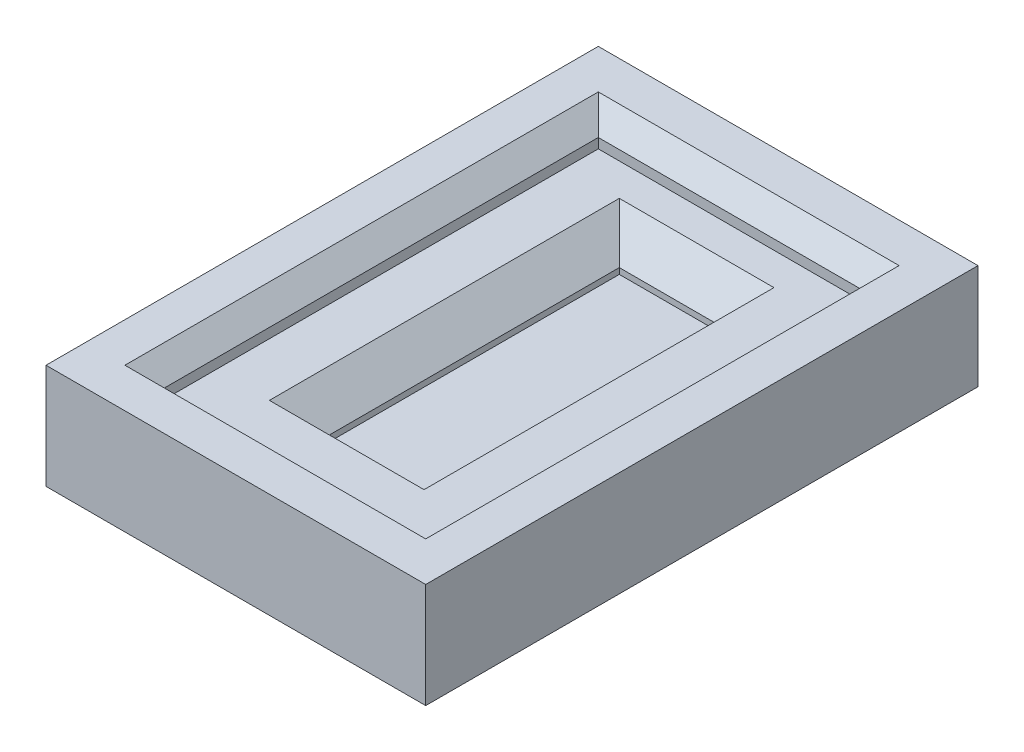
ISO-10303-21;
HEADER;
FILE_DESCRIPTION(('STEP AP214'),'2;1');
FILE_NAME('part.step','',(''),(''),'','','');
FILE_SCHEMA(('AUTOMOTIVE_DESIGN { 1 0 10303 214 1 1 1 1 }'));
ENDSEC;
DATA;
#1=APPLICATION_CONTEXT('core data for automotive mechanical design processes');
#2=APPLICATION_PROTOCOL_DEFINITION('international standard','automotive_design',2000,#1);
#3=PRODUCT_CONTEXT('',#1,'mechanical');
#4=PRODUCT('Part','Part','',(#3));
#5=PRODUCT_RELATED_PRODUCT_CATEGORY('part','',(#4));
#6=PRODUCT_DEFINITION_FORMATION('','',#4);
#7=PRODUCT_DEFINITION_CONTEXT('part definition',#1,'design');
#8=PRODUCT_DEFINITION('design','',#6,#7);
#9=PRODUCT_DEFINITION_SHAPE('','',#8);
#10=(LENGTH_UNIT() NAMED_UNIT(*) SI_UNIT(.MILLI.,.METRE.));
#11=(NAMED_UNIT(*) PLANE_ANGLE_UNIT() SI_UNIT($,.RADIAN.));
#12=(NAMED_UNIT(*) SI_UNIT($,.STERADIAN.) SOLID_ANGLE_UNIT());
#13=UNCERTAINTY_MEASURE_WITH_UNIT(LENGTH_MEASURE(1.E-05),#10,'distance_accuracy_value','');
#14=(GEOMETRIC_REPRESENTATION_CONTEXT(3) GLOBAL_UNCERTAINTY_ASSIGNED_CONTEXT((#13)) GLOBAL_UNIT_ASSIGNED_CONTEXT((#10,
#11,#12)) REPRESENTATION_CONTEXT('',''));
#15=CARTESIAN_POINT('',(0.,0.,0.));
#16=DIRECTION('',(0.,0.,1.));
#17=DIRECTION('',(1.,0.,0.));
#18=AXIS2_PLACEMENT_3D('',#15,#16,#17);
#19=CARTESIAN_POINT('',(-1199.99999999999,-1660.,18485.8011696608));
#20=DIRECTION('',(-1.,0.,0.));
#21=DIRECTION('',(0.,0.,1.));
#22=AXIS2_PLACEMENT_3D('',#19,#20,#21);
#23=PLANE('',#22);
#24=DIRECTION('',(0.,0.,-1.));
#25=VECTOR('',#24,1.);
#26=CARTESIAN_POINT('',(-1199.99999999999,-1660.,18485.8011696608));
#27=LINE('',#26,#25);
#28=CARTESIAN_POINT('',(-1199.99999999999,-1660.,3430.));
#29=VERTEX_POINT('',#28);
#30=CARTESIAN_POINT('',(-1199.99999999999,-1660.,-3920.00000000002));
#31=VERTEX_POINT('',#30);
#32=EDGE_CURVE('E205',#29,#31,#27,.T.);
#33=ORIENTED_EDGE('',*,*,#32,.T.);
#34=DIRECTION('',(0.,1.,0.));
#35=VECTOR('',#34,1.);
#36=CARTESIAN_POINT('',(-1199.99999999999,-1660.,-3920.00000000002));
#37=LINE('',#36,#35);
#38=CARTESIAN_POINT('',(-1199.99999999999,-1510.,-3920.00000000002));
#39=VERTEX_POINT('',#38);
#40=EDGE_CURVE('E54',#31,#39,#37,.T.);
#41=ORIENTED_EDGE('',*,*,#40,.T.);
#42=DIRECTION('',(0.,0.,-1.));
#43=VECTOR('',#42,1.);
#44=CARTESIAN_POINT('',(-1199.99999999999,-1510.,18485.8011696608));
#45=LINE('',#44,#43);
#46=CARTESIAN_POINT('',(-1199.99999999999,-1510.,3430.));
#47=VERTEX_POINT('',#46);
#48=EDGE_CURVE('E208',#47,#39,#45,.T.);
#49=ORIENTED_EDGE('',*,*,#48,.F.);
#50=DIRECTION('',(0.,-1.,0.));
#51=VECTOR('',#50,1.);
#52=CARTESIAN_POINT('',(-1199.99999999999,-1660.,3430.));
#53=LINE('',#52,#51);
#54=EDGE_CURVE('E270',#47,#29,#53,.T.);
#55=ORIENTED_EDGE('',*,*,#54,.T.);
#56=EDGE_LOOP('',(#33,#41,#49,#55));
#57=FACE_BOUND('',#56,.T.);
#58=ADVANCED_FACE('F38',(#57),#23,.F.);
#59=CARTESIAN_POINT('',(-1959.99999999999,-750.,18485.8011696608));
#60=DIRECTION('',(-0.707106781186549,-0.707106781186546,0.));
#61=DIRECTION('',(0.707106781186546,-0.707106781186549,0.));
#62=AXIS2_PLACEMENT_3D('',#59,#60,#61);
#63=PLANE('',#62);
#64=DIRECTION('',(0.,0.,-1.));
#65=VECTOR('',#64,1.);
#66=CARTESIAN_POINT('',(-1959.99999999999,-750.,18485.8011696608));
#67=LINE('',#66,#65);
#68=CARTESIAN_POINT('',(-1959.99999999999,-750.,4190.));
#69=VERTEX_POINT('',#68);
#70=CARTESIAN_POINT('',(-1959.99999999999,-750.,-4680.00000000002));
#71=VERTEX_POINT('',#70);
#72=EDGE_CURVE('E328',#69,#71,#67,.T.);
#73=ORIENTED_EDGE('',*,*,#72,.F.);
#74=DIRECTION('',(0.577350269189625,-0.577350269189627,-0.577350269189625));
#75=VECTOR('',#74,1.);
#76=CARTESIAN_POINT('',(-6725.26705655359,4015.26705655362,8955.2670565536));
#77=LINE('',#76,#75);
#78=EDGE_CURVE('E245',#69,#47,#77,.T.);
#79=ORIENTED_EDGE('',*,*,#78,.T.);
#80=ORIENTED_EDGE('',*,*,#48,.T.);
#81=DIRECTION('',(-0.577350269189623,0.577350269189626,-0.577350269189628));
#82=VECTOR('',#81,1.);
#83=CARTESIAN_POINT('',(5761.9337232203,-8471.93372322032,3041.93372322033));
#84=LINE('',#83,#82);
#85=EDGE_CURVE('E61',#39,#71,#84,.T.);
#86=ORIENTED_EDGE('',*,*,#85,.T.);
#87=EDGE_LOOP('',(#73,#79,#80,#86));
#88=FACE_BOUND('',#87,.T.);
#89=ADVANCED_FACE('F378',(#88),#63,.F.);
#90=CARTESIAN_POINT('',(-3312.49999999999,-750.,18485.8011696608));
#91=DIRECTION('',(0.,-1.,0.));
#92=DIRECTION('',(0.,0.,-1.));
#93=AXIS2_PLACEMENT_3D('',#90,#91,#92);
#94=PLANE('',#93);
#95=DIRECTION('',(-1.,0.,0.));
#96=VECTOR('',#95,1.);
#97=CARTESIAN_POINT('',(19062.9596417098,-750.,4190.));
#98=LINE('',#97,#96);
#99=CARTESIAN_POINT('',(1959.99999999997,-750.,4190.));
#100=VERTEX_POINT('',#99);
#101=EDGE_CURVE('E399',#100,#69,#98,.T.);
#102=ORIENTED_EDGE('',*,*,#101,.T.);
#103=ORIENTED_EDGE('',*,*,#72,.T.);
#104=DIRECTION('',(-1.,0.,0.));
#105=VECTOR('',#104,1.);
#106=CARTESIAN_POINT('',(19062.9596417098,-750.,-4680.00000000002));
#107=LINE('',#106,#105);
#108=CARTESIAN_POINT('',(1959.99999999997,-750.000000000001,-4680.00000000003));
#109=VERTEX_POINT('',#108);
#110=EDGE_CURVE('E256',#109,#71,#107,.T.);
#111=ORIENTED_EDGE('',*,*,#110,.F.);
#112=DIRECTION('',(0.,0.,-1.));
#113=VECTOR('',#112,1.);
#114=CARTESIAN_POINT('',(1959.99999999997,-750.,18485.8011696608));
#115=LINE('',#114,#113);
#116=EDGE_CURVE('E193',#100,#109,#115,.T.);
#117=ORIENTED_EDGE('',*,*,#116,.F.);
#118=EDGE_LOOP('',(#102,#103,#111,#117));
#119=FACE_BOUND('',#118,.T.);
#120=DIRECTION('',(-1.,0.,0.));
#121=VECTOR('',#120,1.);
#122=CARTESIAN_POINT('',(19062.9596417098,-749.999999999999,-5500.));
#123=LINE('',#122,#121);
#124=CARTESIAN_POINT('',(3312.49999999999,-750.,-5500.));
#125=VERTEX_POINT('',#124);
#126=CARTESIAN_POINT('',(-3312.49999999999,-750.,-5500.));
#127=VERTEX_POINT('',#126);
#128=EDGE_CURVE('E242',#125,#127,#123,.T.);
#129=ORIENTED_EDGE('',*,*,#128,.T.);
#130=DIRECTION('',(0.,0.,-1.));
#131=VECTOR('',#130,1.);
#132=CARTESIAN_POINT('',(-3312.49999999999,-750.,18485.8011696608));
#133=LINE('',#132,#131);
#134=CARTESIAN_POINT('',(-3312.49999999999,-749.999999999999,5500.));
#135=VERTEX_POINT('',#134);
#136=EDGE_CURVE('E331',#135,#127,#133,.T.);
#137=ORIENTED_EDGE('',*,*,#136,.F.);
#138=DIRECTION('',(-1.,0.,0.));
#139=VECTOR('',#138,1.);
#140=CARTESIAN_POINT('',(19062.9596417098,-749.999999999999,5500.));
#141=LINE('',#140,#139);
#142=CARTESIAN_POINT('',(3312.49999999999,-749.999999999999,5500.));
#143=VERTEX_POINT('',#142);
#144=EDGE_CURVE('E396',#143,#135,#141,.T.);
#145=ORIENTED_EDGE('',*,*,#144,.F.);
#146=DIRECTION('',(0.,0.,-1.));
#147=VECTOR('',#146,1.);
#148=CARTESIAN_POINT('',(3312.49999999999,-750.,18485.8011696608));
#149=LINE('',#148,#147);
#150=EDGE_CURVE('E185',#143,#125,#149,.T.);
#151=ORIENTED_EDGE('',*,*,#150,.T.);
#152=EDGE_LOOP('',(#129,#137,#145,#151));
#153=FACE_BOUND('',#152,.T.);
#154=ADVANCED_FACE('F382',(#119,#153),#94,.F.);
#155=CARTESIAN_POINT('',(-3312.49999999999,-500.,18485.8011696608));
#156=DIRECTION('',(-1.,0.,0.));
#157=DIRECTION('',(0.,0.,1.));
#158=AXIS2_PLACEMENT_3D('',#155,#156,#157);
#159=PLANE('',#158);
#160=DIRECTION('',(0.,0.,-1.));
#161=VECTOR('',#160,1.);
#162=CARTESIAN_POINT('',(-3312.49999999999,-500.,18485.8011696608));
#163=LINE('',#162,#161);
#164=CARTESIAN_POINT('',(-3312.49999999999,-499.999999999998,5500.));
#165=VERTEX_POINT('',#164);
#166=CARTESIAN_POINT('',(-3312.49999999999,-500.,-5499.99999999999));
#167=VERTEX_POINT('',#166);
#168=EDGE_CURVE('E335',#165,#167,#163,.T.);
#169=ORIENTED_EDGE('',*,*,#168,.F.);
#170=DIRECTION('',(0.,-1.,0.));
#171=VECTOR('',#170,1.);
#172=CARTESIAN_POINT('',(-3312.49999999999,-500.,5500.));
#173=LINE('',#172,#171);
#174=EDGE_CURVE('E289',#165,#135,#173,.T.);
#175=ORIENTED_EDGE('',*,*,#174,.T.);
#176=ORIENTED_EDGE('',*,*,#136,.T.);
#177=DIRECTION('',(0.,1.,0.));
#178=VECTOR('',#177,1.);
#179=CARTESIAN_POINT('',(-3312.49999999999,-500.,-5500.));
#180=LINE('',#179,#178);
#181=EDGE_CURVE('E244',#127,#167,#180,.T.);
#182=ORIENTED_EDGE('',*,*,#181,.T.);
#183=EDGE_LOOP('',(#169,#175,#176,#182));
#184=FACE_BOUND('',#183,.T.);
#185=ADVANCED_FACE('F374',(#184),#159,.F.);
#186=CARTESIAN_POINT('',(-3812.49999999999,0.,18485.8011696608));
#187=DIRECTION('',(-0.707106781186549,-0.707106781186546,0.));
#188=DIRECTION('',(0.707106781186546,-0.707106781186549,0.));
#189=AXIS2_PLACEMENT_3D('',#186,#187,#188);
#190=PLANE('',#189);
#191=DIRECTION('',(0.,0.,-1.));
#192=VECTOR('',#191,1.);
#193=CARTESIAN_POINT('',(-3812.49999999999,0.,18485.8011696608));
#194=LINE('',#193,#192);
#195=CARTESIAN_POINT('',(-3812.49999999999,1.33226762955019E-12,5999.99999999999));
#196=VERTEX_POINT('',#195);
#197=CARTESIAN_POINT('',(-3812.49999999999,0.,-6000.));
#198=VERTEX_POINT('',#197);
#199=EDGE_CURVE('E339',#196,#198,#194,.T.);
#200=ORIENTED_EDGE('',*,*,#199,.F.);
#201=DIRECTION('',(0.577350269189624,-0.577350269189627,-0.577350269189626));
#202=VECTOR('',#201,1.);
#203=CARTESIAN_POINT('',(-7974.43372322026,4161.93372322029,10161.9337232203));
#204=LINE('',#203,#202);
#205=EDGE_CURVE('E159',#196,#165,#204,.T.);
#206=ORIENTED_EDGE('',*,*,#205,.T.);
#207=ORIENTED_EDGE('',*,*,#168,.T.);
#208=DIRECTION('',(-0.577350269189623,0.577350269189626,-0.577350269189628));
#209=VECTOR('',#208,1.);
#210=CARTESIAN_POINT('',(4349.43372322028,-8161.93372322032,2161.93372322034));
#211=LINE('',#210,#209);
#212=EDGE_CURVE('E249',#167,#198,#211,.T.);
#213=ORIENTED_EDGE('',*,*,#212,.T.);
#214=EDGE_LOOP('',(#200,#206,#207,#213));
#215=FACE_BOUND('',#214,.T.);
#216=ADVANCED_FACE('F367',(#215),#190,.F.);
#217=CARTESIAN_POINT('',(-4812.49999999999,0.,18485.8011696608));
#218=DIRECTION('',(0.,-1.,0.));
#219=DIRECTION('',(0.,0.,-1.));
#220=AXIS2_PLACEMENT_3D('',#217,#218,#219);
#221=PLANE('',#220);
#222=DIRECTION('',(-1.,0.,0.));
#223=VECTOR('',#222,1.);
#224=CARTESIAN_POINT('',(19062.9596417098,1.33226762955019E-12,5999.99999999999));
#225=LINE('',#224,#223);
#226=CARTESIAN_POINT('',(3812.49999999999,1.33226762955019E-12,5999.99999999999));
#227=VERTEX_POINT('',#226);
#228=EDGE_CURVE('E154',#227,#196,#225,.T.);
#229=ORIENTED_EDGE('',*,*,#228,.T.);
#230=ORIENTED_EDGE('',*,*,#199,.T.);
#231=DIRECTION('',(-1.,0.,0.));
#232=VECTOR('',#231,1.);
#233=CARTESIAN_POINT('',(19062.9596417098,1.77635683940025E-12,-6000.));
#234=LINE('',#233,#232);
#235=CARTESIAN_POINT('',(3812.49999999999,0.,-6000.));
#236=VERTEX_POINT('',#235);
#237=EDGE_CURVE('E166',#236,#198,#234,.T.);
#238=ORIENTED_EDGE('',*,*,#237,.F.);
#239=DIRECTION('',(0.,0.,-1.));
#240=VECTOR('',#239,1.);
#241=CARTESIAN_POINT('',(3812.49999999999,0.,18485.8011696608));
#242=LINE('',#241,#240);
#243=EDGE_CURVE('E171',#227,#236,#242,.T.);
#244=ORIENTED_EDGE('',*,*,#243,.F.);
#245=EDGE_LOOP('',(#229,#230,#238,#244));
#246=FACE_BOUND('',#245,.T.);
#247=DIRECTION('',(-1.,0.,0.));
#248=VECTOR('',#247,1.);
#249=CARTESIAN_POINT('',(-4812.49999999999,0.,-7000.));
#250=LINE('',#249,#248);
#251=CARTESIAN_POINT('',(4812.49999999999,0.,-7000.));
#252=VERTEX_POINT('',#251);
#253=CARTESIAN_POINT('',(-4812.49999999999,0.,-7000.));
#254=VERTEX_POINT('',#253);
#255=EDGE_CURVE('E297',#252,#254,#250,.T.);
#256=ORIENTED_EDGE('',*,*,#255,.T.);
#257=DIRECTION('',(0.,0.,-1.));
#258=VECTOR('',#257,1.);
#259=CARTESIAN_POINT('',(-4812.49999999999,0.,18485.8011696608));
#260=LINE('',#259,#258);
#261=CARTESIAN_POINT('',(-4812.49999999999,0.,7000.));
#262=VERTEX_POINT('',#261);
#263=EDGE_CURVE('E342',#262,#254,#260,.T.);
#264=ORIENTED_EDGE('',*,*,#263,.F.);
#265=DIRECTION('',(-1.,0.,0.));
#266=VECTOR('',#265,1.);
#267=CARTESIAN_POINT('',(-4812.49999999999,0.,7000.));
#268=LINE('',#267,#266);
#269=CARTESIAN_POINT('',(4812.49999999999,0.,7000.));
#270=VERTEX_POINT('',#269);
#271=EDGE_CURVE('E204',#270,#262,#268,.T.);
#272=ORIENTED_EDGE('',*,*,#271,.F.);
#273=DIRECTION('',(0.,0.,-1.));
#274=VECTOR('',#273,1.);
#275=CARTESIAN_POINT('',(4812.49999999999,0.,18485.8011696608));
#276=LINE('',#275,#274);
#277=EDGE_CURVE('E180',#270,#252,#276,.T.);
#278=ORIENTED_EDGE('',*,*,#277,.T.);
#279=EDGE_LOOP('',(#256,#264,#272,#278));
#280=FACE_BOUND('',#279,.T.);
#281=ADVANCED_FACE('F176',(#246,#280),#221,.F.);
#282=CARTESIAN_POINT('',(-4812.49999999999,-2660.,18485.8011696608));
#283=DIRECTION('',(1.,0.,0.));
#284=DIRECTION('',(0.,1.,0.));
#285=AXIS2_PLACEMENT_3D('',#282,#283,#284);
#286=PLANE('',#285);
#287=ORIENTED_EDGE('',*,*,#263,.T.);
#288=DIRECTION('',(0.,-1.,0.));
#289=VECTOR('',#288,1.);
#290=CARTESIAN_POINT('',(-4812.49999999999,-2660.,-7000.));
#291=LINE('',#290,#289);
#292=CARTESIAN_POINT('',(-4812.49999999999,-2660.,-7000.));
#293=VERTEX_POINT('',#292);
#294=EDGE_CURVE('E305',#254,#293,#291,.T.);
#295=ORIENTED_EDGE('',*,*,#294,.T.);
#296=DIRECTION('',(0.,0.,-1.));
#297=VECTOR('',#296,1.);
#298=CARTESIAN_POINT('',(-4812.49999999999,-2660.,18485.8011696608));
#299=LINE('',#298,#297);
#300=CARTESIAN_POINT('',(-4812.49999999999,-2660.,7000.));
#301=VERTEX_POINT('',#300);
#302=EDGE_CURVE('E345',#301,#293,#299,.T.);
#303=ORIENTED_EDGE('',*,*,#302,.F.);
#304=DIRECTION('',(0.,-1.,0.));
#305=VECTOR('',#304,1.);
#306=CARTESIAN_POINT('',(-4812.49999999999,-2660.,7000.));
#307=LINE('',#306,#305);
#308=EDGE_CURVE('E319',#262,#301,#307,.T.);
#309=ORIENTED_EDGE('',*,*,#308,.F.);
#310=EDGE_LOOP('',(#287,#295,#303,#309));
#311=FACE_BOUND('',#310,.T.);
#312=ADVANCED_FACE('F363',(#311),#286,.F.);
#313=CARTESIAN_POINT('',(4812.49999999999,-2660.,18485.8011696608));
#314=DIRECTION('',(0.,1.,0.));
#315=DIRECTION('',(-1.,0.,0.));
#316=AXIS2_PLACEMENT_3D('',#313,#314,#315);
#317=PLANE('',#316);
#318=DIRECTION('',(1.,0.,0.));
#319=VECTOR('',#318,1.);
#320=CARTESIAN_POINT('',(4812.49999999999,-2660.,7000.));
#321=LINE('',#320,#319);
#322=CARTESIAN_POINT('',(4812.49999999999,-2660.,7000.));
#323=VERTEX_POINT('',#322);
#324=EDGE_CURVE('E315',#301,#323,#321,.T.);
#325=ORIENTED_EDGE('',*,*,#324,.F.);
#326=ORIENTED_EDGE('',*,*,#302,.T.);
#327=DIRECTION('',(1.,0.,0.));
#328=VECTOR('',#327,1.);
#329=CARTESIAN_POINT('',(4812.49999999999,-2660.,-7000.));
#330=LINE('',#329,#328);
#331=CARTESIAN_POINT('',(4812.49999999999,-2660.,-7000.));
#332=VERTEX_POINT('',#331);
#333=EDGE_CURVE('E301',#293,#332,#330,.T.);
#334=ORIENTED_EDGE('',*,*,#333,.T.);
#335=DIRECTION('',(0.,0.,-1.));
#336=VECTOR('',#335,1.);
#337=CARTESIAN_POINT('',(4812.49999999999,-2660.,18485.8011696608));
#338=LINE('',#337,#336);
#339=EDGE_CURVE('E187',#323,#332,#338,.T.);
#340=ORIENTED_EDGE('',*,*,#339,.F.);
#341=EDGE_LOOP('',(#325,#326,#334,#340));
#342=FACE_BOUND('',#341,.T.);
#343=ADVANCED_FACE('F360',(#342),#317,.F.);
#344=CARTESIAN_POINT('',(4812.49999999999,0.,18485.8011696608));
#345=DIRECTION('',(-1.,0.,0.));
#346=DIRECTION('',(0.,0.,1.));
#347=AXIS2_PLACEMENT_3D('',#344,#345,#346);
#348=PLANE('',#347);
#349=DIRECTION('',(0.,1.,0.));
#350=VECTOR('',#349,1.);
#351=CARTESIAN_POINT('',(4812.49999999999,0.,-7000.));
#352=LINE('',#351,#350);
#353=EDGE_CURVE('E209',#332,#252,#352,.T.);
#354=ORIENTED_EDGE('',*,*,#353,.T.);
#355=ORIENTED_EDGE('',*,*,#277,.F.);
#356=DIRECTION('',(0.,1.,0.));
#357=VECTOR('',#356,1.);
#358=CARTESIAN_POINT('',(4812.49999999999,0.,7000.));
#359=LINE('',#358,#357);
#360=EDGE_CURVE('E215',#323,#270,#359,.T.);
#361=ORIENTED_EDGE('',*,*,#360,.F.);
#362=ORIENTED_EDGE('',*,*,#339,.T.);
#363=EDGE_LOOP('',(#354,#355,#361,#362));
#364=FACE_BOUND('',#363,.T.);
#365=ADVANCED_FACE('F352',(#364),#348,.F.);
#366=CARTESIAN_POINT('',(3312.49999999999,-500.,18485.8011696608));
#367=DIRECTION('',(0.707106781186549,-0.707106781186546,0.));
#368=DIRECTION('',(0.707106781186546,0.707106781186549,0.));
#369=AXIS2_PLACEMENT_3D('',#366,#367,#368);
#370=PLANE('',#369);
#371=DIRECTION('',(0.,0.,-1.));
#372=VECTOR('',#371,1.);
#373=CARTESIAN_POINT('',(3312.49999999999,-500.,18485.8011696608));
#374=LINE('',#373,#372);
#375=CARTESIAN_POINT('',(3312.49999999999,-499.999999999998,5500.));
#376=VERTEX_POINT('',#375);
#377=CARTESIAN_POINT('',(3312.49999999999,-500.,-5500.));
#378=VERTEX_POINT('',#377);
#379=EDGE_CURVE('E174',#376,#378,#374,.T.);
#380=ORIENTED_EDGE('',*,*,#379,.F.);
#381=DIRECTION('',(0.577350269189625,0.577350269189627,0.577350269189625));
#382=VECTOR('',#381,1.);
#383=CARTESIAN_POINT('',(7641.10038988693,3828.60038988695,9828.60038988693));
#384=LINE('',#383,#382);
#385=EDGE_CURVE('E11',#376,#227,#384,.T.);
#386=ORIENTED_EDGE('',*,*,#385,.T.);
#387=ORIENTED_EDGE('',*,*,#243,.T.);
#388=DIRECTION('',(-0.577350269189624,-0.577350269189626,0.577350269189628));
#389=VECTOR('',#388,1.);
#390=CARTESIAN_POINT('',(-4682.76705655361,-8495.26705655364,2495.26705655367));
#391=LINE('',#390,#389);
#392=EDGE_CURVE('E47',#236,#378,#391,.T.);
#393=ORIENTED_EDGE('',*,*,#392,.T.);
#394=EDGE_LOOP('',(#380,#386,#387,#393));
#395=FACE_BOUND('',#394,.T.);
#396=ADVANCED_FACE('F170',(#395),#370,.F.);
#397=CARTESIAN_POINT('',(3312.49999999999,-750.,18485.8011696608));
#398=DIRECTION('',(1.,0.,0.));
#399=DIRECTION('',(0.,0.,-1.));
#400=AXIS2_PLACEMENT_3D('',#397,#398,#399);
#401=PLANE('',#400);
#402=ORIENTED_EDGE('',*,*,#150,.F.);
#403=DIRECTION('',(0.,1.,0.));
#404=VECTOR('',#403,1.);
#405=CARTESIAN_POINT('',(3312.49999999999,-750.,5500.));
#406=LINE('',#405,#404);
#407=EDGE_CURVE('E235',#143,#376,#406,.T.);
#408=ORIENTED_EDGE('',*,*,#407,.T.);
#409=ORIENTED_EDGE('',*,*,#379,.T.);
#410=DIRECTION('',(0.,-1.,0.));
#411=VECTOR('',#410,1.);
#412=CARTESIAN_POINT('',(3312.49999999999,-750.,-5500.));
#413=LINE('',#412,#411);
#414=EDGE_CURVE('E234',#378,#125,#413,.T.);
#415=ORIENTED_EDGE('',*,*,#414,.T.);
#416=EDGE_LOOP('',(#402,#408,#409,#415));
#417=FACE_BOUND('',#416,.T.);
#418=ADVANCED_FACE('F233',(#417),#401,.F.);
#419=CARTESIAN_POINT('',(1199.99999999998,-1510.,18485.8011696608));
#420=DIRECTION('',(0.707106781186549,-0.707106781186546,0.));
#421=DIRECTION('',(0.707106781186546,0.707106781186549,0.));
#422=AXIS2_PLACEMENT_3D('',#419,#420,#421);
#423=PLANE('',#422);
#424=DIRECTION('',(0.,0.,-1.));
#425=VECTOR('',#424,1.);
#426=CARTESIAN_POINT('',(1199.99999999998,-1510.,18485.8011696608));
#427=LINE('',#426,#425);
#428=CARTESIAN_POINT('',(1199.99999999997,-1510.,3430.));
#429=VERTEX_POINT('',#428);
#430=CARTESIAN_POINT('',(1199.99999999998,-1510.,-3920.00000000002));
#431=VERTEX_POINT('',#430);
#432=EDGE_CURVE('E196',#429,#431,#427,.T.);
#433=ORIENTED_EDGE('',*,*,#432,.F.);
#434=DIRECTION('',(0.577350269189625,0.577350269189627,0.577350269189625));
#435=VECTOR('',#434,1.);
#436=CARTESIAN_POINT('',(6218.60038988691,3508.60038988695,8448.60038988693));
#437=LINE('',#436,#435);
#438=EDGE_CURVE('E221',#429,#100,#437,.T.);
#439=ORIENTED_EDGE('',*,*,#438,.T.);
#440=ORIENTED_EDGE('',*,*,#116,.T.);
#441=DIRECTION('',(-0.577350269189623,-0.577350269189626,0.577350269189628));
#442=VECTOR('',#441,1.);
#443=CARTESIAN_POINT('',(-6268.60038988698,-8978.60038988698,3548.60038988699));
#444=LINE('',#443,#442);
#445=EDGE_CURVE('E218',#109,#431,#444,.T.);
#446=ORIENTED_EDGE('',*,*,#445,.T.);
#447=EDGE_LOOP('',(#433,#439,#440,#446));
#448=FACE_BOUND('',#447,.T.);
#449=ADVANCED_FACE('F431',(#448),#423,.F.);
#450=CARTESIAN_POINT('',(1199.99999999998,-1660.,18485.8011696608));
#451=DIRECTION('',(1.,0.,0.));
#452=DIRECTION('',(0.,0.,-1.));
#453=AXIS2_PLACEMENT_3D('',#450,#451,#452);
#454=PLANE('',#453);
#455=ORIENTED_EDGE('',*,*,#432,.T.);
#456=DIRECTION('',(0.,-1.,0.));
#457=VECTOR('',#456,1.);
#458=CARTESIAN_POINT('',(1199.99999999998,-1660.,-3920.00000000002));
#459=LINE('',#458,#457);
#460=CARTESIAN_POINT('',(1199.99999999998,-1660.,-3920.00000000002));
#461=VERTEX_POINT('',#460);
#462=EDGE_CURVE('E275',#431,#461,#459,.T.);
#463=ORIENTED_EDGE('',*,*,#462,.T.);
#464=DIRECTION('',(0.,0.,-1.));
#465=VECTOR('',#464,1.);
#466=CARTESIAN_POINT('',(1199.99999999998,-1660.,18485.8011696608));
#467=LINE('',#466,#465);
#468=CARTESIAN_POINT('',(1199.99999999997,-1660.,3430.));
#469=VERTEX_POINT('',#468);
#470=EDGE_CURVE('E200',#469,#461,#467,.T.);
#471=ORIENTED_EDGE('',*,*,#470,.F.);
#472=DIRECTION('',(0.,1.,0.));
#473=VECTOR('',#472,1.);
#474=CARTESIAN_POINT('',(1199.99999999998,-1660.,3430.));
#475=LINE('',#474,#473);
#476=EDGE_CURVE('E266',#469,#429,#475,.T.);
#477=ORIENTED_EDGE('',*,*,#476,.T.);
#478=EDGE_LOOP('',(#455,#463,#471,#477));
#479=FACE_BOUND('',#478,.T.);
#480=ADVANCED_FACE('F433',(#479),#454,.F.);
#481=CARTESIAN_POINT('',(-1199.99999999999,-1660.,18485.8011696608));
#482=DIRECTION('',(0.,-1.,0.));
#483=DIRECTION('',(0.,0.,-1.));
#484=AXIS2_PLACEMENT_3D('',#481,#482,#483);
#485=PLANE('',#484);
#486=ORIENTED_EDGE('',*,*,#470,.T.);
#487=DIRECTION('',(-1.,0.,0.));
#488=VECTOR('',#487,1.);
#489=CARTESIAN_POINT('',(-1199.99999999999,-1660.,-3920.00000000002));
#490=LINE('',#489,#488);
#491=EDGE_CURVE('E214',#461,#31,#490,.T.);
#492=ORIENTED_EDGE('',*,*,#491,.T.);
#493=ORIENTED_EDGE('',*,*,#32,.F.);
#494=DIRECTION('',(1.,0.,0.));
#495=VECTOR('',#494,1.);
#496=CARTESIAN_POINT('',(-1199.99999999999,-1660.,3430.));
#497=LINE('',#496,#495);
#498=EDGE_CURVE('E210',#29,#469,#497,.T.);
#499=ORIENTED_EDGE('',*,*,#498,.T.);
#500=EDGE_LOOP('',(#486,#492,#493,#499));
#501=FACE_BOUND('',#500,.T.);
#502=ADVANCED_FACE('F417',(#501),#485,.F.);
#503=CARTESIAN_POINT('',(-3312.49999999999,-750.,7000.));
#504=DIRECTION('',(0.,0.,1.));
#505=DIRECTION('',(1.,0.,0.));
#506=AXIS2_PLACEMENT_3D('',#503,#504,#505);
#507=PLANE('',#506);
#508=ORIENTED_EDGE('',*,*,#360,.T.);
#509=ORIENTED_EDGE('',*,*,#271,.T.);
#510=ORIENTED_EDGE('',*,*,#308,.T.);
#511=ORIENTED_EDGE('',*,*,#324,.T.);
#512=EDGE_LOOP('',(#508,#509,#510,#511));
#513=FACE_BOUND('',#512,.T.);
#514=ADVANCED_FACE('F40',(#513),#507,.T.);
#515=CARTESIAN_POINT('',(-3312.49999999999,-750.,-7000.));
#516=DIRECTION('',(0.,0.,-1.));
#517=DIRECTION('',(1.,0.,0.));
#518=AXIS2_PLACEMENT_3D('',#515,#516,#517);
#519=PLANE('',#518);
#520=ORIENTED_EDGE('',*,*,#255,.F.);
#521=ORIENTED_EDGE('',*,*,#353,.F.);
#522=ORIENTED_EDGE('',*,*,#333,.F.);
#523=ORIENTED_EDGE('',*,*,#294,.F.);
#524=EDGE_LOOP('',(#520,#521,#522,#523));
#525=FACE_BOUND('',#524,.T.);
#526=ADVANCED_FACE('F358',(#525),#519,.T.);
#527=CARTESIAN_POINT('',(19062.9596417098,-1510.,-3920.00000000002));
#528=DIRECTION('',(0.,0.,1.));
#529=DIRECTION('',(1.,0.,0.));
#530=AXIS2_PLACEMENT_3D('',#527,#528,#529);
#531=PLANE('',#530);
#532=ORIENTED_EDGE('',*,*,#40,.F.);
#533=ORIENTED_EDGE('',*,*,#491,.F.);
#534=ORIENTED_EDGE('',*,*,#462,.F.);
#535=DIRECTION('',(-1.,0.,0.));
#536=VECTOR('',#535,1.);
#537=CARTESIAN_POINT('',(19062.9596417098,-1510.,-3920.00000000002));
#538=LINE('',#537,#536);
#539=EDGE_CURVE('E262',#431,#39,#538,.T.);
#540=ORIENTED_EDGE('',*,*,#539,.T.);
#541=EDGE_LOOP('',(#532,#533,#534,#540));
#542=FACE_BOUND('',#541,.T.);
#543=ADVANCED_FACE('F422',(#542),#531,.T.);
#544=CARTESIAN_POINT('',(19062.9596417098,-750.,-4680.00000000002));
#545=DIRECTION('',(0.,0.707106781186549,0.707106781186546));
#546=DIRECTION('',(0.,-0.707106781186546,0.707106781186549));
#547=AXIS2_PLACEMENT_3D('',#544,#545,#546);
#548=PLANE('',#547);
#549=ORIENTED_EDGE('',*,*,#85,.F.);
#550=ORIENTED_EDGE('',*,*,#539,.F.);
#551=ORIENTED_EDGE('',*,*,#445,.F.);
#552=ORIENTED_EDGE('',*,*,#110,.T.);
#553=EDGE_LOOP('',(#549,#550,#551,#552));
#554=FACE_BOUND('',#553,.T.);
#555=ADVANCED_FACE('F426',(#554),#548,.T.);
#556=CARTESIAN_POINT('',(19062.9596417098,-499.999999999998,-5500.));
#557=DIRECTION('',(0.,0.,1.));
#558=DIRECTION('',(1.,0.,0.));
#559=AXIS2_PLACEMENT_3D('',#556,#557,#558);
#560=PLANE('',#559);
#561=ORIENTED_EDGE('',*,*,#181,.F.);
#562=ORIENTED_EDGE('',*,*,#128,.F.);
#563=ORIENTED_EDGE('',*,*,#414,.F.);
#564=DIRECTION('',(-1.,0.,0.));
#565=VECTOR('',#564,1.);
#566=CARTESIAN_POINT('',(19062.9596417098,-499.999999999998,-5500.));
#567=LINE('',#566,#565);
#568=EDGE_CURVE('E241',#378,#167,#567,.T.);
#569=ORIENTED_EDGE('',*,*,#568,.T.);
#570=EDGE_LOOP('',(#561,#562,#563,#569));
#571=FACE_BOUND('',#570,.T.);
#572=ADVANCED_FACE('F240',(#571),#560,.T.);
#573=CARTESIAN_POINT('',(19062.9596417098,1.77635683940025E-12,-6000.));
#574=DIRECTION('',(0.,0.707106781186549,0.707106781186546));
#575=DIRECTION('',(0.,-0.707106781186546,0.707106781186549));
#576=AXIS2_PLACEMENT_3D('',#573,#574,#575);
#577=PLANE('',#576);
#578=ORIENTED_EDGE('',*,*,#212,.F.);
#579=ORIENTED_EDGE('',*,*,#568,.F.);
#580=ORIENTED_EDGE('',*,*,#392,.F.);
#581=ORIENTED_EDGE('',*,*,#237,.T.);
#582=EDGE_LOOP('',(#578,#579,#580,#581));
#583=FACE_BOUND('',#582,.T.);
#584=ADVANCED_FACE('F248',(#583),#577,.T.);
#585=CARTESIAN_POINT('',(19062.9596417098,-499.999999999998,5500.));
#586=DIRECTION('',(0.,0.707106781186546,-0.707106781186549));
#587=DIRECTION('',(0.,0.707106781186549,0.707106781186546));
#588=AXIS2_PLACEMENT_3D('',#585,#586,#587);
#589=PLANE('',#588);
#590=ORIENTED_EDGE('',*,*,#205,.F.);
#591=ORIENTED_EDGE('',*,*,#228,.F.);
#592=ORIENTED_EDGE('',*,*,#385,.F.);
#593=DIRECTION('',(-1.,0.,0.));
#594=VECTOR('',#593,1.);
#595=CARTESIAN_POINT('',(19062.9596417098,-499.999999999998,5500.));
#596=LINE('',#595,#594);
#597=EDGE_CURVE('E165',#376,#165,#596,.T.);
#598=ORIENTED_EDGE('',*,*,#597,.T.);
#599=EDGE_LOOP('',(#590,#591,#592,#598));
#600=FACE_BOUND('',#599,.T.);
#601=ADVANCED_FACE('F155',(#600),#589,.T.);
#602=CARTESIAN_POINT('',(19062.9596417098,-749.999999999999,5500.));
#603=DIRECTION('',(0.,0.,-1.));
#604=DIRECTION('',(-1.,0.,0.));
#605=AXIS2_PLACEMENT_3D('',#602,#603,#604);
#606=PLANE('',#605);
#607=ORIENTED_EDGE('',*,*,#174,.F.);
#608=ORIENTED_EDGE('',*,*,#597,.F.);
#609=ORIENTED_EDGE('',*,*,#407,.F.);
#610=ORIENTED_EDGE('',*,*,#144,.T.);
#611=EDGE_LOOP('',(#607,#608,#609,#610));
#612=FACE_BOUND('',#611,.T.);
#613=ADVANCED_FACE('F440',(#612),#606,.T.);
#614=CARTESIAN_POINT('',(19062.9596417098,-1510.,3430.));
#615=DIRECTION('',(0.,0.707106781186546,-0.707106781186549));
#616=DIRECTION('',(0.,0.707106781186549,0.707106781186546));
#617=AXIS2_PLACEMENT_3D('',#614,#615,#616);
#618=PLANE('',#617);
#619=ORIENTED_EDGE('',*,*,#78,.F.);
#620=ORIENTED_EDGE('',*,*,#101,.F.);
#621=ORIENTED_EDGE('',*,*,#438,.F.);
#622=DIRECTION('',(-1.,0.,0.));
#623=VECTOR('',#622,1.);
#624=CARTESIAN_POINT('',(19062.9596417098,-1510.,3430.));
#625=LINE('',#624,#623);
#626=EDGE_CURVE('E271',#429,#47,#625,.T.);
#627=ORIENTED_EDGE('',*,*,#626,.T.);
#628=EDGE_LOOP('',(#619,#620,#621,#627));
#629=FACE_BOUND('',#628,.T.);
#630=ADVANCED_FACE('F413',(#629),#618,.T.);
#631=CARTESIAN_POINT('',(19062.9596417098,-1660.,3430.));
#632=DIRECTION('',(0.,0.,-1.));
#633=DIRECTION('',(-1.,0.,0.));
#634=AXIS2_PLACEMENT_3D('',#631,#632,#633);
#635=PLANE('',#634);
#636=ORIENTED_EDGE('',*,*,#54,.F.);
#637=ORIENTED_EDGE('',*,*,#626,.F.);
#638=ORIENTED_EDGE('',*,*,#476,.F.);
#639=ORIENTED_EDGE('',*,*,#498,.F.);
#640=EDGE_LOOP('',(#636,#637,#638,#639));
#641=FACE_BOUND('',#640,.T.);
#642=ADVANCED_FACE('F434',(#641),#635,.T.);
#643=CLOSED_SHELL('',(#58,#89,#154,#185,#216,#281,#312,#343,#365,#396,#418,#449,#480,#502,#514,
#526,#543,#555,#572,#584,#601,#613,#630,#642));
#644=MANIFOLD_SOLID_BREP('B2',#643);
#645=ADVANCED_BREP_SHAPE_REPRESENTATION('',(#18,#644),#14);
#646=SHAPE_DEFINITION_REPRESENTATION(#9,#645);
ENDSEC;
END-ISO-10303-21;
